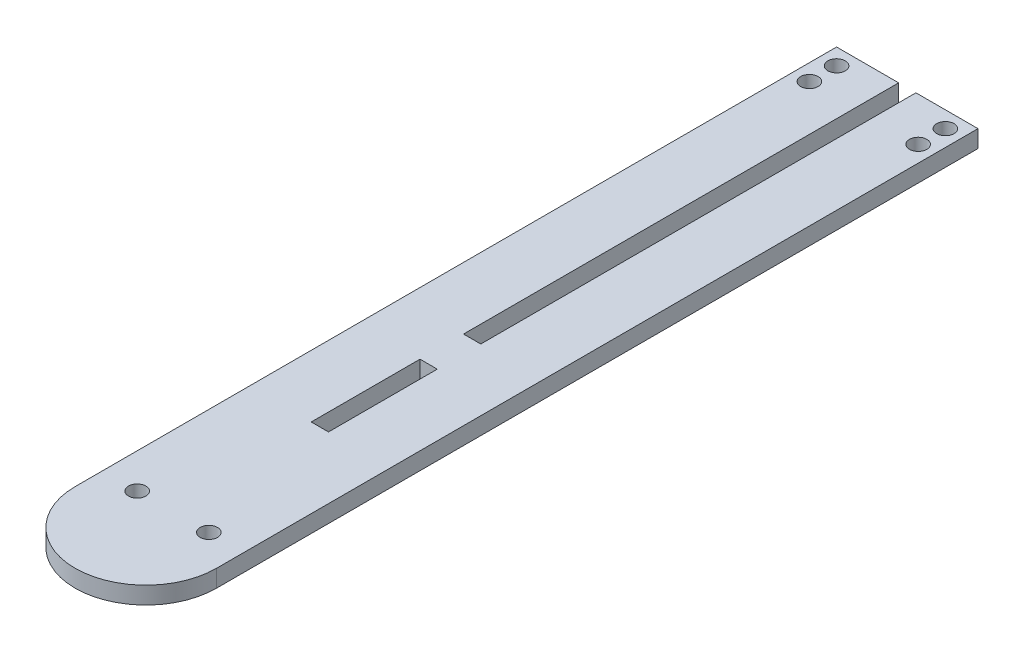
ISO-10303-21;
HEADER;
FILE_DESCRIPTION(('STEP AP214'),'2;1');
FILE_NAME('part.step','',(''),(''),'','','');
FILE_SCHEMA(('AUTOMOTIVE_DESIGN { 1 0 10303 214 1 1 1 1 }'));
ENDSEC;
DATA;
#1=APPLICATION_CONTEXT('core data for automotive mechanical design processes');
#2=APPLICATION_PROTOCOL_DEFINITION('international standard','automotive_design',2000,#1);
#3=PRODUCT_CONTEXT('',#1,'mechanical');
#4=PRODUCT('Part','Part','',(#3));
#5=PRODUCT_RELATED_PRODUCT_CATEGORY('part','',(#4));
#6=PRODUCT_DEFINITION_FORMATION('','',#4);
#7=PRODUCT_DEFINITION_CONTEXT('part definition',#1,'design');
#8=PRODUCT_DEFINITION('design','',#6,#7);
#9=PRODUCT_DEFINITION_SHAPE('','',#8);
#10=(LENGTH_UNIT() NAMED_UNIT(*) SI_UNIT(.MILLI.,.METRE.));
#11=(NAMED_UNIT(*) PLANE_ANGLE_UNIT() SI_UNIT($,.RADIAN.));
#12=(NAMED_UNIT(*) SI_UNIT($,.STERADIAN.) SOLID_ANGLE_UNIT());
#13=UNCERTAINTY_MEASURE_WITH_UNIT(LENGTH_MEASURE(1.E-05),#10,'distance_accuracy_value','');
#14=(GEOMETRIC_REPRESENTATION_CONTEXT(3) GLOBAL_UNCERTAINTY_ASSIGNED_CONTEXT((#13)) GLOBAL_UNIT_ASSIGNED_CONTEXT((#10,
#11,#12)) REPRESENTATION_CONTEXT('',''));
#15=CARTESIAN_POINT('',(0.,0.,0.));
#16=DIRECTION('',(0.,0.,1.));
#17=DIRECTION('',(1.,0.,0.));
#18=AXIS2_PLACEMENT_3D('',#15,#16,#17);
#19=CARTESIAN_POINT('',(-1.58749999999998,3.175,140.));
#20=DIRECTION('',(0.,1.,0.));
#21=DIRECTION('',(0.,0.,1.));
#22=AXIS2_PLACEMENT_3D('',#19,#20,#21);
#23=PLANE('',#22);
#24=CARTESIAN_POINT('',(-11.5875,3.175,3.));
#25=DIRECTION('',(0.,1.,0.));
#26=DIRECTION('',(0.,0.,1.));
#27=AXIS2_PLACEMENT_3D('',#24,#25,#26);
#28=CIRCLE('',#27,1.6);
#29=CARTESIAN_POINT('',(-11.5875,3.175,4.6));
#30=VERTEX_POINT('',#29);
#31=EDGE_CURVE('E340',#30,#30,#28,.T.);
#32=ORIENTED_EDGE('',*,*,#31,.F.);
#33=EDGE_LOOP('',(#32));
#34=FACE_BOUND('',#33,.T.);
#35=CARTESIAN_POINT('',(8.41250000000002,3.175,8.));
#36=DIRECTION('',(0.,1.,0.));
#37=DIRECTION('',(0.,0.,1.));
#38=AXIS2_PLACEMENT_3D('',#35,#36,#37);
#39=CIRCLE('',#38,1.6);
#40=CARTESIAN_POINT('',(8.41250000000002,3.175,9.6));
#41=VERTEX_POINT('',#40);
#42=EDGE_CURVE('E337',#41,#41,#39,.T.);
#43=ORIENTED_EDGE('',*,*,#42,.F.);
#44=EDGE_LOOP('',(#43));
#45=FACE_BOUND('',#44,.T.);
#46=CARTESIAN_POINT('',(8.41250000000001,3.175,3.));
#47=DIRECTION('',(0.,1.,0.));
#48=DIRECTION('',(0.,0.,1.));
#49=AXIS2_PLACEMENT_3D('',#46,#47,#48);
#50=CIRCLE('',#49,1.6);
#51=CARTESIAN_POINT('',(8.41250000000001,3.175,4.6));
#52=VERTEX_POINT('',#51);
#53=EDGE_CURVE('E317',#52,#52,#50,.T.);
#54=ORIENTED_EDGE('',*,*,#53,.F.);
#55=EDGE_LOOP('',(#54));
#56=FACE_BOUND('',#55,.T.);
#57=CARTESIAN_POINT('',(-11.5875,3.175,8.));
#58=DIRECTION('',(0.,1.,0.));
#59=DIRECTION('',(0.,0.,1.));
#60=AXIS2_PLACEMENT_3D('',#57,#58,#59);
#61=CIRCLE('',#60,1.6);
#62=CARTESIAN_POINT('',(-11.5875,3.175,9.6));
#63=VERTEX_POINT('',#62);
#64=EDGE_CURVE('E333',#63,#63,#61,.T.);
#65=ORIENTED_EDGE('',*,*,#64,.F.);
#66=EDGE_LOOP('',(#65));
#67=FACE_BOUND('',#66,.T.);
#68=CARTESIAN_POINT('',(5.00000000000001,3.175,135.));
#69=DIRECTION('',(0.,1.,0.));
#70=DIRECTION('',(0.,0.,1.));
#71=AXIS2_PLACEMENT_3D('',#68,#69,#70);
#72=CIRCLE('',#71,1.59999999999999);
#73=CARTESIAN_POINT('',(5.00000000000001,3.175,136.6));
#74=VERTEX_POINT('',#73);
#75=EDGE_CURVE('E149',#74,#74,#72,.T.);
#76=ORIENTED_EDGE('',*,*,#75,.F.);
#77=EDGE_LOOP('',(#76));
#78=FACE_BOUND('',#77,.T.);
#79=CARTESIAN_POINT('',(-8.17499999999999,3.175,135.));
#80=DIRECTION('',(0.,1.,0.));
#81=DIRECTION('',(0.,0.,1.));
#82=AXIS2_PLACEMENT_3D('',#79,#80,#81);
#83=CIRCLE('',#82,1.59999999999999);
#84=CARTESIAN_POINT('',(-8.17499999999999,3.175,136.6));
#85=VERTEX_POINT('',#84);
#86=EDGE_CURVE('E347',#85,#85,#83,.T.);
#87=ORIENTED_EDGE('',*,*,#86,.F.);
#88=EDGE_LOOP('',(#87));
#89=FACE_BOUND('',#88,.T.);
#90=DIRECTION('',(-1.,0.,0.));
#91=VECTOR('',#90,1.);
#92=CARTESIAN_POINT('',(-14.5875,3.175,0.));
#93=LINE('',#92,#91);
#94=CARTESIAN_POINT('',(-3.175,3.175,0.));
#95=VERTEX_POINT('',#94);
#96=CARTESIAN_POINT('',(-14.5875,3.175,0.));
#97=VERTEX_POINT('',#96);
#98=EDGE_CURVE('E159',#95,#97,#93,.T.);
#99=ORIENTED_EDGE('',*,*,#98,.T.);
#100=DIRECTION('',(0.,0.,1.));
#101=VECTOR('',#100,1.);
#102=CARTESIAN_POINT('',(-14.5875,3.175,0.));
#103=LINE('',#102,#101);
#104=CARTESIAN_POINT('',(-14.5875,3.175,140.));
#105=VERTEX_POINT('',#104);
#106=EDGE_CURVE('E162',#97,#105,#103,.T.);
#107=ORIENTED_EDGE('',*,*,#106,.T.);
#108=CARTESIAN_POINT('',(-1.58749999999998,3.175,140.));
#109=DIRECTION('',(0.,1.,0.));
#110=DIRECTION('',(0.,0.,1.));
#111=AXIS2_PLACEMENT_3D('',#108,#109,#110);
#112=CIRCLE('',#111,13.);
#113=CARTESIAN_POINT('',(11.4125,3.175,140.));
#114=VERTEX_POINT('',#113);
#115=EDGE_CURVE('E165',#105,#114,#112,.T.);
#116=ORIENTED_EDGE('',*,*,#115,.T.);
#117=DIRECTION('',(0.,0.,-1.));
#118=VECTOR('',#117,1.);
#119=CARTESIAN_POINT('',(11.4125,3.175,0.));
#120=LINE('',#119,#118);
#121=CARTESIAN_POINT('',(11.4125,3.175,0.));
#122=VERTEX_POINT('',#121);
#123=EDGE_CURVE('E167',#114,#122,#120,.T.);
#124=ORIENTED_EDGE('',*,*,#123,.T.);
#125=DIRECTION('',(-1.,0.,0.));
#126=VECTOR('',#125,1.);
#127=CARTESIAN_POINT('',(11.4125,3.175,0.));
#128=LINE('',#127,#126);
#129=CARTESIAN_POINT('',(0.,3.175,0.));
#130=VERTEX_POINT('',#129);
#131=EDGE_CURVE('E169',#122,#130,#128,.T.);
#132=ORIENTED_EDGE('',*,*,#131,.T.);
#133=DIRECTION('',(0.,0.,1.));
#134=VECTOR('',#133,1.);
#135=CARTESIAN_POINT('',(0.,3.175,0.));
#136=LINE('',#135,#134);
#137=CARTESIAN_POINT('',(0.,3.175,80.));
#138=VERTEX_POINT('',#137);
#139=EDGE_CURVE('E171',#130,#138,#136,.T.);
#140=ORIENTED_EDGE('',*,*,#139,.T.);
#141=DIRECTION('',(-1.,0.,0.));
#142=VECTOR('',#141,1.);
#143=CARTESIAN_POINT('',(-3.175,3.175,80.));
#144=LINE('',#143,#142);
#145=CARTESIAN_POINT('',(-3.175,3.175,80.));
#146=VERTEX_POINT('',#145);
#147=EDGE_CURVE('E173',#138,#146,#144,.T.);
#148=ORIENTED_EDGE('',*,*,#147,.T.);
#149=DIRECTION('',(0.,0.,-1.));
#150=VECTOR('',#149,1.);
#151=CARTESIAN_POINT('',(-3.175,3.175,0.));
#152=LINE('',#151,#150);
#153=EDGE_CURVE('E175',#146,#95,#152,.T.);
#154=ORIENTED_EDGE('',*,*,#153,.T.);
#155=EDGE_LOOP('',(#99,#107,#116,#124,#132,#140,#148,#154));
#156=FACE_BOUND('',#155,.T.);
#157=DIRECTION('',(1.,0.,0.));
#158=VECTOR('',#157,1.);
#159=CARTESIAN_POINT('',(-3.175,3.175,108.));
#160=LINE('',#159,#158);
#161=CARTESIAN_POINT('',(-3.175,3.175,108.));
#162=VERTEX_POINT('',#161);
#163=CARTESIAN_POINT('',(0.,3.175,108.));
#164=VERTEX_POINT('',#163);
#165=EDGE_CURVE('E129',#162,#164,#160,.T.);
#166=ORIENTED_EDGE('',*,*,#165,.F.);
#167=DIRECTION('',(0.,0.,1.));
#168=VECTOR('',#167,1.);
#169=CARTESIAN_POINT('',(-3.175,3.175,88.));
#170=LINE('',#169,#168);
#171=CARTESIAN_POINT('',(-3.175,3.175,88.));
#172=VERTEX_POINT('',#171);
#173=EDGE_CURVE('E121',#172,#162,#170,.T.);
#174=ORIENTED_EDGE('',*,*,#173,.F.);
#175=DIRECTION('',(-1.,0.,0.));
#176=VECTOR('',#175,1.);
#177=CARTESIAN_POINT('',(-3.175,3.175,88.));
#178=LINE('',#177,#176);
#179=CARTESIAN_POINT('',(0.,3.175,88.));
#180=VERTEX_POINT('',#179);
#181=EDGE_CURVE('E143',#180,#172,#178,.T.);
#182=ORIENTED_EDGE('',*,*,#181,.F.);
#183=DIRECTION('',(0.,0.,-1.));
#184=VECTOR('',#183,1.);
#185=CARTESIAN_POINT('',(0.,3.175,88.));
#186=LINE('',#185,#184);
#187=EDGE_CURVE('E141',#164,#180,#186,.T.);
#188=ORIENTED_EDGE('',*,*,#187,.F.);
#189=EDGE_LOOP('',(#166,#174,#182,#188));
#190=FACE_BOUND('',#189,.T.);
#191=ADVANCED_FACE('F32',(#34,#45,#56,#67,#78,#89,#156,#190),#23,.T.);
#192=CARTESIAN_POINT('',(-1.58749999999998,0.,140.));
#193=DIRECTION('',(0.,1.,0.));
#194=DIRECTION('',(0.,0.,1.));
#195=AXIS2_PLACEMENT_3D('',#192,#193,#194);
#196=PLANE('',#195);
#197=CARTESIAN_POINT('',(-11.5875,0.,3.));
#198=DIRECTION('',(0.,1.,0.));
#199=DIRECTION('',(0.,0.,1.));
#200=AXIS2_PLACEMENT_3D('',#197,#198,#199);
#201=CIRCLE('',#200,1.6);
#202=CARTESIAN_POINT('',(-11.5875,0.,4.6));
#203=VERTEX_POINT('',#202);
#204=EDGE_CURVE('E325',#203,#203,#201,.T.);
#205=ORIENTED_EDGE('',*,*,#204,.T.);
#206=EDGE_LOOP('',(#205));
#207=FACE_BOUND('',#206,.T.);
#208=CARTESIAN_POINT('',(8.41250000000002,0.,8.));
#209=DIRECTION('',(0.,1.,0.));
#210=DIRECTION('',(0.,0.,1.));
#211=AXIS2_PLACEMENT_3D('',#208,#209,#210);
#212=CIRCLE('',#211,1.6);
#213=CARTESIAN_POINT('',(8.41250000000002,0.,9.6));
#214=VERTEX_POINT('',#213);
#215=EDGE_CURVE('E322',#214,#214,#212,.T.);
#216=ORIENTED_EDGE('',*,*,#215,.T.);
#217=EDGE_LOOP('',(#216));
#218=FACE_BOUND('',#217,.T.);
#219=CARTESIAN_POINT('',(8.41250000000001,0.,3.));
#220=DIRECTION('',(0.,1.,0.));
#221=DIRECTION('',(0.,0.,1.));
#222=AXIS2_PLACEMENT_3D('',#219,#220,#221);
#223=CIRCLE('',#222,1.6);
#224=CARTESIAN_POINT('',(8.41250000000001,0.,4.6));
#225=VERTEX_POINT('',#224);
#226=EDGE_CURVE('E320',#225,#225,#223,.T.);
#227=ORIENTED_EDGE('',*,*,#226,.T.);
#228=EDGE_LOOP('',(#227));
#229=FACE_BOUND('',#228,.T.);
#230=CARTESIAN_POINT('',(-11.5875,0.,8.));
#231=DIRECTION('',(0.,1.,0.));
#232=DIRECTION('',(0.,0.,1.));
#233=AXIS2_PLACEMENT_3D('',#230,#231,#232);
#234=CIRCLE('',#233,1.6);
#235=CARTESIAN_POINT('',(-11.5875,0.,9.6));
#236=VERTEX_POINT('',#235);
#237=EDGE_CURVE('E329',#236,#236,#234,.T.);
#238=ORIENTED_EDGE('',*,*,#237,.T.);
#239=EDGE_LOOP('',(#238));
#240=FACE_BOUND('',#239,.T.);
#241=CARTESIAN_POINT('',(5.00000000000001,0.,135.));
#242=DIRECTION('',(0.,1.,0.));
#243=DIRECTION('',(0.,0.,1.));
#244=AXIS2_PLACEMENT_3D('',#241,#242,#243);
#245=CIRCLE('',#244,1.59999999999999);
#246=CARTESIAN_POINT('',(5.00000000000001,0.,136.6));
#247=VERTEX_POINT('',#246);
#248=EDGE_CURVE('E344',#247,#247,#245,.T.);
#249=ORIENTED_EDGE('',*,*,#248,.T.);
#250=EDGE_LOOP('',(#249));
#251=FACE_BOUND('',#250,.T.);
#252=CARTESIAN_POINT('',(-8.17499999999999,0.,135.));
#253=DIRECTION('',(0.,1.,0.));
#254=DIRECTION('',(0.,0.,1.));
#255=AXIS2_PLACEMENT_3D('',#252,#253,#254);
#256=CIRCLE('',#255,1.59999999999999);
#257=CARTESIAN_POINT('',(-8.17499999999999,0.,136.6));
#258=VERTEX_POINT('',#257);
#259=EDGE_CURVE('E343',#258,#258,#256,.T.);
#260=ORIENTED_EDGE('',*,*,#259,.T.);
#261=EDGE_LOOP('',(#260));
#262=FACE_BOUND('',#261,.T.);
#263=DIRECTION('',(-1.,0.,0.));
#264=VECTOR('',#263,1.);
#265=CARTESIAN_POINT('',(-14.5875,0.,0.));
#266=LINE('',#265,#264);
#267=CARTESIAN_POINT('',(-3.175,0.,0.));
#268=VERTEX_POINT('',#267);
#269=CARTESIAN_POINT('',(-14.5875,0.,0.));
#270=VERTEX_POINT('',#269);
#271=EDGE_CURVE('E137',#268,#270,#266,.T.);
#272=ORIENTED_EDGE('',*,*,#271,.F.);
#273=DIRECTION('',(0.,0.,-1.));
#274=VECTOR('',#273,1.);
#275=CARTESIAN_POINT('',(-3.175,0.,0.));
#276=LINE('',#275,#274);
#277=CARTESIAN_POINT('',(-3.175,0.,80.));
#278=VERTEX_POINT('',#277);
#279=EDGE_CURVE('E163',#278,#268,#276,.T.);
#280=ORIENTED_EDGE('',*,*,#279,.F.);
#281=DIRECTION('',(-1.,0.,0.));
#282=VECTOR('',#281,1.);
#283=CARTESIAN_POINT('',(-3.175,0.,80.));
#284=LINE('',#283,#282);
#285=CARTESIAN_POINT('',(0.,0.,80.));
#286=VERTEX_POINT('',#285);
#287=EDGE_CURVE('E190',#286,#278,#284,.T.);
#288=ORIENTED_EDGE('',*,*,#287,.F.);
#289=DIRECTION('',(0.,0.,1.));
#290=VECTOR('',#289,1.);
#291=CARTESIAN_POINT('',(0.,0.,0.));
#292=LINE('',#291,#290);
#293=CARTESIAN_POINT('',(0.,0.,0.));
#294=VERTEX_POINT('',#293);
#295=EDGE_CURVE('E188',#294,#286,#292,.T.);
#296=ORIENTED_EDGE('',*,*,#295,.F.);
#297=DIRECTION('',(-1.,0.,0.));
#298=VECTOR('',#297,1.);
#299=CARTESIAN_POINT('',(11.4125,0.,0.));
#300=LINE('',#299,#298);
#301=CARTESIAN_POINT('',(11.4125,0.,0.));
#302=VERTEX_POINT('',#301);
#303=EDGE_CURVE('E186',#302,#294,#300,.T.);
#304=ORIENTED_EDGE('',*,*,#303,.F.);
#305=DIRECTION('',(0.,0.,-1.));
#306=VECTOR('',#305,1.);
#307=CARTESIAN_POINT('',(11.4125,0.,0.));
#308=LINE('',#307,#306);
#309=CARTESIAN_POINT('',(11.4125,0.,140.));
#310=VERTEX_POINT('',#309);
#311=EDGE_CURVE('E184',#310,#302,#308,.T.);
#312=ORIENTED_EDGE('',*,*,#311,.F.);
#313=CARTESIAN_POINT('',(-1.58749999999998,0.,140.));
#314=DIRECTION('',(0.,1.,0.));
#315=DIRECTION('',(0.,0.,1.));
#316=AXIS2_PLACEMENT_3D('',#313,#314,#315);
#317=CIRCLE('',#316,13.);
#318=CARTESIAN_POINT('',(-14.5875,0.,140.));
#319=VERTEX_POINT('',#318);
#320=EDGE_CURVE('E182',#319,#310,#317,.T.);
#321=ORIENTED_EDGE('',*,*,#320,.F.);
#322=DIRECTION('',(0.,0.,1.));
#323=VECTOR('',#322,1.);
#324=CARTESIAN_POINT('',(-14.5875,0.,0.));
#325=LINE('',#324,#323);
#326=EDGE_CURVE('E180',#270,#319,#325,.T.);
#327=ORIENTED_EDGE('',*,*,#326,.F.);
#328=EDGE_LOOP('',(#272,#280,#288,#296,#304,#312,#321,#327));
#329=FACE_BOUND('',#328,.T.);
#330=DIRECTION('',(0.,0.,1.));
#331=VECTOR('',#330,1.);
#332=CARTESIAN_POINT('',(-3.175,0.,88.));
#333=LINE('',#332,#331);
#334=CARTESIAN_POINT('',(-3.175,0.,88.));
#335=VERTEX_POINT('',#334);
#336=CARTESIAN_POINT('',(-3.175,0.,108.));
#337=VERTEX_POINT('',#336);
#338=EDGE_CURVE('E55',#335,#337,#333,.T.);
#339=ORIENTED_EDGE('',*,*,#338,.T.);
#340=DIRECTION('',(1.,0.,0.));
#341=VECTOR('',#340,1.);
#342=CARTESIAN_POINT('',(-3.175,0.,108.));
#343=LINE('',#342,#341);
#344=CARTESIAN_POINT('',(0.,0.,108.));
#345=VERTEX_POINT('',#344);
#346=EDGE_CURVE('E136',#337,#345,#343,.T.);
#347=ORIENTED_EDGE('',*,*,#346,.T.);
#348=DIRECTION('',(0.,0.,-1.));
#349=VECTOR('',#348,1.);
#350=CARTESIAN_POINT('',(0.,0.,88.));
#351=LINE('',#350,#349);
#352=CARTESIAN_POINT('',(0.,0.,88.));
#353=VERTEX_POINT('',#352);
#354=EDGE_CURVE('E151',#345,#353,#351,.T.);
#355=ORIENTED_EDGE('',*,*,#354,.T.);
#356=DIRECTION('',(-1.,0.,0.));
#357=VECTOR('',#356,1.);
#358=CARTESIAN_POINT('',(-3.175,0.,88.));
#359=LINE('',#358,#357);
#360=EDGE_CURVE('E130',#353,#335,#359,.T.);
#361=ORIENTED_EDGE('',*,*,#360,.T.);
#362=EDGE_LOOP('',(#339,#347,#355,#361));
#363=FACE_BOUND('',#362,.T.);
#364=ADVANCED_FACE('F220',(#207,#218,#229,#240,#251,#262,#329,#363),#196,.F.);
#365=CARTESIAN_POINT('',(-14.5875,3.175,0.));
#366=DIRECTION('',(0.,0.,1.));
#367=DIRECTION('',(1.,0.,0.));
#368=AXIS2_PLACEMENT_3D('',#365,#366,#367);
#369=PLANE('',#368);
#370=ORIENTED_EDGE('',*,*,#271,.T.);
#371=DIRECTION('',(0.,-1.,0.));
#372=VECTOR('',#371,1.);
#373=CARTESIAN_POINT('',(-14.5875,3.175,0.));
#374=LINE('',#373,#372);
#375=EDGE_CURVE('E11',#97,#270,#374,.T.);
#376=ORIENTED_EDGE('',*,*,#375,.F.);
#377=ORIENTED_EDGE('',*,*,#98,.F.);
#378=DIRECTION('',(0.,-1.,0.));
#379=VECTOR('',#378,1.);
#380=CARTESIAN_POINT('',(-3.175,3.175,0.));
#381=LINE('',#380,#379);
#382=EDGE_CURVE('E177',#95,#268,#381,.T.);
#383=ORIENTED_EDGE('',*,*,#382,.T.);
#384=EDGE_LOOP('',(#370,#376,#377,#383));
#385=FACE_BOUND('',#384,.T.);
#386=ADVANCED_FACE('F34',(#385),#369,.F.);
#387=CARTESIAN_POINT('',(-14.5875,3.175,0.));
#388=DIRECTION('',(1.,0.,0.));
#389=DIRECTION('',(0.,0.,-1.));
#390=AXIS2_PLACEMENT_3D('',#387,#388,#389);
#391=PLANE('',#390);
#392=ORIENTED_EDGE('',*,*,#326,.T.);
#393=DIRECTION('',(0.,-1.,0.));
#394=VECTOR('',#393,1.);
#395=CARTESIAN_POINT('',(-14.5875,3.175,140.));
#396=LINE('',#395,#394);
#397=EDGE_CURVE('E40',#105,#319,#396,.T.);
#398=ORIENTED_EDGE('',*,*,#397,.F.);
#399=ORIENTED_EDGE('',*,*,#106,.F.);
#400=ORIENTED_EDGE('',*,*,#375,.T.);
#401=EDGE_LOOP('',(#392,#398,#399,#400));
#402=FACE_BOUND('',#401,.T.);
#403=ADVANCED_FACE('F237',(#402),#391,.F.);
#404=CARTESIAN_POINT('',(-1.58749999999998,3.175,140.));
#405=DIRECTION('',(0.,-1.,0.));
#406=DIRECTION('',(0.,0.,-1.));
#407=AXIS2_PLACEMENT_3D('',#404,#405,#406);
#408=CYLINDRICAL_SURFACE('',#407,13.);
#409=ORIENTED_EDGE('',*,*,#320,.T.);
#410=DIRECTION('',(0.,-1.,0.));
#411=VECTOR('',#410,1.);
#412=CARTESIAN_POINT('',(11.4125,3.175,140.));
#413=LINE('',#412,#411);
#414=EDGE_CURVE('E207',#114,#310,#413,.T.);
#415=ORIENTED_EDGE('',*,*,#414,.F.);
#416=ORIENTED_EDGE('',*,*,#115,.F.);
#417=ORIENTED_EDGE('',*,*,#397,.T.);
#418=EDGE_LOOP('',(#409,#415,#416,#417));
#419=FACE_BOUND('',#418,.T.);
#420=ADVANCED_FACE('F214',(#419),#408,.T.);
#421=CARTESIAN_POINT('',(11.4125,3.175,0.));
#422=DIRECTION('',(-1.,0.,0.));
#423=DIRECTION('',(0.,0.,1.));
#424=AXIS2_PLACEMENT_3D('',#421,#422,#423);
#425=PLANE('',#424);
#426=ORIENTED_EDGE('',*,*,#311,.T.);
#427=DIRECTION('',(0.,-1.,0.));
#428=VECTOR('',#427,1.);
#429=CARTESIAN_POINT('',(11.4125,3.175,0.));
#430=LINE('',#429,#428);
#431=EDGE_CURVE('E204',#122,#302,#430,.T.);
#432=ORIENTED_EDGE('',*,*,#431,.F.);
#433=ORIENTED_EDGE('',*,*,#123,.F.);
#434=ORIENTED_EDGE('',*,*,#414,.T.);
#435=EDGE_LOOP('',(#426,#432,#433,#434));
#436=FACE_BOUND('',#435,.T.);
#437=ADVANCED_FACE('F226',(#436),#425,.F.);
#438=CARTESIAN_POINT('',(11.4125,3.175,0.));
#439=DIRECTION('',(0.,0.,1.));
#440=DIRECTION('',(1.,0.,0.));
#441=AXIS2_PLACEMENT_3D('',#438,#439,#440);
#442=PLANE('',#441);
#443=ORIENTED_EDGE('',*,*,#303,.T.);
#444=DIRECTION('',(0.,-1.,0.));
#445=VECTOR('',#444,1.);
#446=CARTESIAN_POINT('',(0.,3.175,0.));
#447=LINE('',#446,#445);
#448=EDGE_CURVE('E201',#130,#294,#447,.T.);
#449=ORIENTED_EDGE('',*,*,#448,.F.);
#450=ORIENTED_EDGE('',*,*,#131,.F.);
#451=ORIENTED_EDGE('',*,*,#431,.T.);
#452=EDGE_LOOP('',(#443,#449,#450,#451));
#453=FACE_BOUND('',#452,.T.);
#454=ADVANCED_FACE('F230',(#453),#442,.F.);
#455=CARTESIAN_POINT('',(0.,3.175,0.));
#456=DIRECTION('',(1.,0.,0.));
#457=DIRECTION('',(0.,0.,-1.));
#458=AXIS2_PLACEMENT_3D('',#455,#456,#457);
#459=PLANE('',#458);
#460=ORIENTED_EDGE('',*,*,#295,.T.);
#461=DIRECTION('',(0.,-1.,0.));
#462=VECTOR('',#461,1.);
#463=CARTESIAN_POINT('',(0.,3.175,80.));
#464=LINE('',#463,#462);
#465=EDGE_CURVE('E198',#138,#286,#464,.T.);
#466=ORIENTED_EDGE('',*,*,#465,.F.);
#467=ORIENTED_EDGE('',*,*,#139,.F.);
#468=ORIENTED_EDGE('',*,*,#448,.T.);
#469=EDGE_LOOP('',(#460,#466,#467,#468));
#470=FACE_BOUND('',#469,.T.);
#471=ADVANCED_FACE('F250',(#470),#459,.F.);
#472=CARTESIAN_POINT('',(-3.175,3.175,80.));
#473=DIRECTION('',(0.,0.,1.));
#474=DIRECTION('',(1.,0.,0.));
#475=AXIS2_PLACEMENT_3D('',#472,#473,#474);
#476=PLANE('',#475);
#477=ORIENTED_EDGE('',*,*,#287,.T.);
#478=DIRECTION('',(0.,-1.,0.));
#479=VECTOR('',#478,1.);
#480=CARTESIAN_POINT('',(-3.175,3.175,80.));
#481=LINE('',#480,#479);
#482=EDGE_CURVE('E195',#146,#278,#481,.T.);
#483=ORIENTED_EDGE('',*,*,#482,.F.);
#484=ORIENTED_EDGE('',*,*,#147,.F.);
#485=ORIENTED_EDGE('',*,*,#465,.T.);
#486=EDGE_LOOP('',(#477,#483,#484,#485));
#487=FACE_BOUND('',#486,.T.);
#488=ADVANCED_FACE('F248',(#487),#476,.F.);
#489=CARTESIAN_POINT('',(-3.175,3.175,0.));
#490=DIRECTION('',(-1.,0.,0.));
#491=DIRECTION('',(0.,0.,1.));
#492=AXIS2_PLACEMENT_3D('',#489,#490,#491);
#493=PLANE('',#492);
#494=ORIENTED_EDGE('',*,*,#279,.T.);
#495=ORIENTED_EDGE('',*,*,#382,.F.);
#496=ORIENTED_EDGE('',*,*,#153,.F.);
#497=ORIENTED_EDGE('',*,*,#482,.T.);
#498=EDGE_LOOP('',(#494,#495,#496,#497));
#499=FACE_BOUND('',#498,.T.);
#500=ADVANCED_FACE('F243',(#499),#493,.F.);
#501=CARTESIAN_POINT('',(-3.175,3.175,88.));
#502=DIRECTION('',(1.,0.,0.));
#503=DIRECTION('',(0.,0.,-1.));
#504=AXIS2_PLACEMENT_3D('',#501,#502,#503);
#505=PLANE('',#504);
#506=ORIENTED_EDGE('',*,*,#338,.F.);
#507=DIRECTION('',(0.,-1.,0.));
#508=VECTOR('',#507,1.);
#509=CARTESIAN_POINT('',(-3.175,3.175,88.));
#510=LINE('',#509,#508);
#511=EDGE_CURVE('E125',#172,#335,#510,.T.);
#512=ORIENTED_EDGE('',*,*,#511,.F.);
#513=ORIENTED_EDGE('',*,*,#173,.T.);
#514=DIRECTION('',(0.,-1.,0.));
#515=VECTOR('',#514,1.);
#516=CARTESIAN_POINT('',(-3.175,3.175,108.));
#517=LINE('',#516,#515);
#518=EDGE_CURVE('E124',#162,#337,#517,.T.);
#519=ORIENTED_EDGE('',*,*,#518,.T.);
#520=EDGE_LOOP('',(#506,#512,#513,#519));
#521=FACE_BOUND('',#520,.T.);
#522=ADVANCED_FACE('F123',(#521),#505,.T.);
#523=CARTESIAN_POINT('',(-3.175,3.175,108.));
#524=DIRECTION('',(0.,0.,-1.));
#525=DIRECTION('',(-1.,0.,0.));
#526=AXIS2_PLACEMENT_3D('',#523,#524,#525);
#527=PLANE('',#526);
#528=ORIENTED_EDGE('',*,*,#346,.F.);
#529=ORIENTED_EDGE('',*,*,#518,.F.);
#530=ORIENTED_EDGE('',*,*,#165,.T.);
#531=DIRECTION('',(0.,-1.,0.));
#532=VECTOR('',#531,1.);
#533=CARTESIAN_POINT('',(0.,3.175,108.));
#534=LINE('',#533,#532);
#535=EDGE_CURVE('E138',#164,#345,#534,.T.);
#536=ORIENTED_EDGE('',*,*,#535,.T.);
#537=EDGE_LOOP('',(#528,#529,#530,#536));
#538=FACE_BOUND('',#537,.T.);
#539=ADVANCED_FACE('F133',(#538),#527,.T.);
#540=CARTESIAN_POINT('',(0.,3.175,88.));
#541=DIRECTION('',(-1.,0.,0.));
#542=DIRECTION('',(0.,0.,1.));
#543=AXIS2_PLACEMENT_3D('',#540,#541,#542);
#544=PLANE('',#543);
#545=ORIENTED_EDGE('',*,*,#354,.F.);
#546=ORIENTED_EDGE('',*,*,#535,.F.);
#547=ORIENTED_EDGE('',*,*,#187,.T.);
#548=DIRECTION('',(0.,-1.,0.));
#549=VECTOR('',#548,1.);
#550=CARTESIAN_POINT('',(0.,3.175,88.));
#551=LINE('',#550,#549);
#552=EDGE_CURVE('E47',#180,#353,#551,.T.);
#553=ORIENTED_EDGE('',*,*,#552,.T.);
#554=EDGE_LOOP('',(#545,#546,#547,#553));
#555=FACE_BOUND('',#554,.T.);
#556=ADVANCED_FACE('F279',(#555),#544,.T.);
#557=CARTESIAN_POINT('',(-3.175,3.175,88.));
#558=DIRECTION('',(0.,0.,1.));
#559=DIRECTION('',(1.,0.,0.));
#560=AXIS2_PLACEMENT_3D('',#557,#558,#559);
#561=PLANE('',#560);
#562=ORIENTED_EDGE('',*,*,#360,.F.);
#563=ORIENTED_EDGE('',*,*,#552,.F.);
#564=ORIENTED_EDGE('',*,*,#181,.T.);
#565=ORIENTED_EDGE('',*,*,#511,.T.);
#566=EDGE_LOOP('',(#562,#563,#564,#565));
#567=FACE_BOUND('',#566,.T.);
#568=ADVANCED_FACE('F283',(#567),#561,.T.);
#569=CARTESIAN_POINT('',(-8.17499999999999,0.,135.));
#570=DIRECTION('',(0.,1.,0.));
#571=DIRECTION('',(0.,0.,1.));
#572=AXIS2_PLACEMENT_3D('',#569,#570,#571);
#573=CYLINDRICAL_SURFACE('',#572,1.59999999999999);
#574=ORIENTED_EDGE('',*,*,#86,.T.);
#575=EDGE_LOOP('',(#574));
#576=FACE_BOUND('',#575,.T.);
#577=ORIENTED_EDGE('',*,*,#259,.F.);
#578=EDGE_LOOP('',(#577));
#579=FACE_BOUND('',#578,.T.);
#580=ADVANCED_FACE('F289',(#576,#579),#573,.F.);
#581=CARTESIAN_POINT('',(5.00000000000001,0.,135.));
#582=DIRECTION('',(0.,1.,0.));
#583=DIRECTION('',(0.,0.,1.));
#584=AXIS2_PLACEMENT_3D('',#581,#582,#583);
#585=CYLINDRICAL_SURFACE('',#584,1.59999999999999);
#586=ORIENTED_EDGE('',*,*,#75,.T.);
#587=EDGE_LOOP('',(#586));
#588=FACE_BOUND('',#587,.T.);
#589=ORIENTED_EDGE('',*,*,#248,.F.);
#590=EDGE_LOOP('',(#589));
#591=FACE_BOUND('',#590,.T.);
#592=ADVANCED_FACE('F292',(#588,#591),#585,.F.);
#593=CARTESIAN_POINT('',(-11.5875,0.,8.));
#594=DIRECTION('',(0.,1.,0.));
#595=DIRECTION('',(0.,0.,1.));
#596=AXIS2_PLACEMENT_3D('',#593,#594,#595);
#597=CYLINDRICAL_SURFACE('',#596,1.6);
#598=ORIENTED_EDGE('',*,*,#64,.T.);
#599=EDGE_LOOP('',(#598));
#600=FACE_BOUND('',#599,.T.);
#601=ORIENTED_EDGE('',*,*,#237,.F.);
#602=EDGE_LOOP('',(#601));
#603=FACE_BOUND('',#602,.T.);
#604=ADVANCED_FACE('F296',(#600,#603),#597,.F.);
#605=CARTESIAN_POINT('',(8.41250000000001,0.,3.));
#606=DIRECTION('',(0.,1.,0.));
#607=DIRECTION('',(0.,0.,1.));
#608=AXIS2_PLACEMENT_3D('',#605,#606,#607);
#609=CYLINDRICAL_SURFACE('',#608,1.6);
#610=ORIENTED_EDGE('',*,*,#53,.T.);
#611=EDGE_LOOP('',(#610));
#612=FACE_BOUND('',#611,.T.);
#613=ORIENTED_EDGE('',*,*,#226,.F.);
#614=EDGE_LOOP('',(#613));
#615=FACE_BOUND('',#614,.T.);
#616=ADVANCED_FACE('F300',(#612,#615),#609,.F.);
#617=CARTESIAN_POINT('',(8.41250000000002,0.,8.));
#618=DIRECTION('',(0.,1.,0.));
#619=DIRECTION('',(0.,0.,1.));
#620=AXIS2_PLACEMENT_3D('',#617,#618,#619);
#621=CYLINDRICAL_SURFACE('',#620,1.6);
#622=ORIENTED_EDGE('',*,*,#42,.T.);
#623=EDGE_LOOP('',(#622));
#624=FACE_BOUND('',#623,.T.);
#625=ORIENTED_EDGE('',*,*,#215,.F.);
#626=EDGE_LOOP('',(#625));
#627=FACE_BOUND('',#626,.T.);
#628=ADVANCED_FACE('F302',(#624,#627),#621,.F.);
#629=CARTESIAN_POINT('',(-11.5875,0.,3.));
#630=DIRECTION('',(0.,1.,0.));
#631=DIRECTION('',(0.,0.,1.));
#632=AXIS2_PLACEMENT_3D('',#629,#630,#631);
#633=CYLINDRICAL_SURFACE('',#632,1.6);
#634=ORIENTED_EDGE('',*,*,#31,.T.);
#635=EDGE_LOOP('',(#634));
#636=FACE_BOUND('',#635,.T.);
#637=ORIENTED_EDGE('',*,*,#204,.F.);
#638=EDGE_LOOP('',(#637));
#639=FACE_BOUND('',#638,.T.);
#640=ADVANCED_FACE('F305',(#636,#639),#633,.F.);
#641=CLOSED_SHELL('',(#191,#364,#386,#403,#420,#437,#454,#471,#488,#500,#522,#539,#556,#568,
#580,#592,#604,#616,#628,#640));
#642=MANIFOLD_SOLID_BREP('B2',#641);
#643=ADVANCED_BREP_SHAPE_REPRESENTATION('',(#18,#642),#14);
#644=SHAPE_DEFINITION_REPRESENTATION(#9,#643);
ENDSEC;
END-ISO-10303-21;
